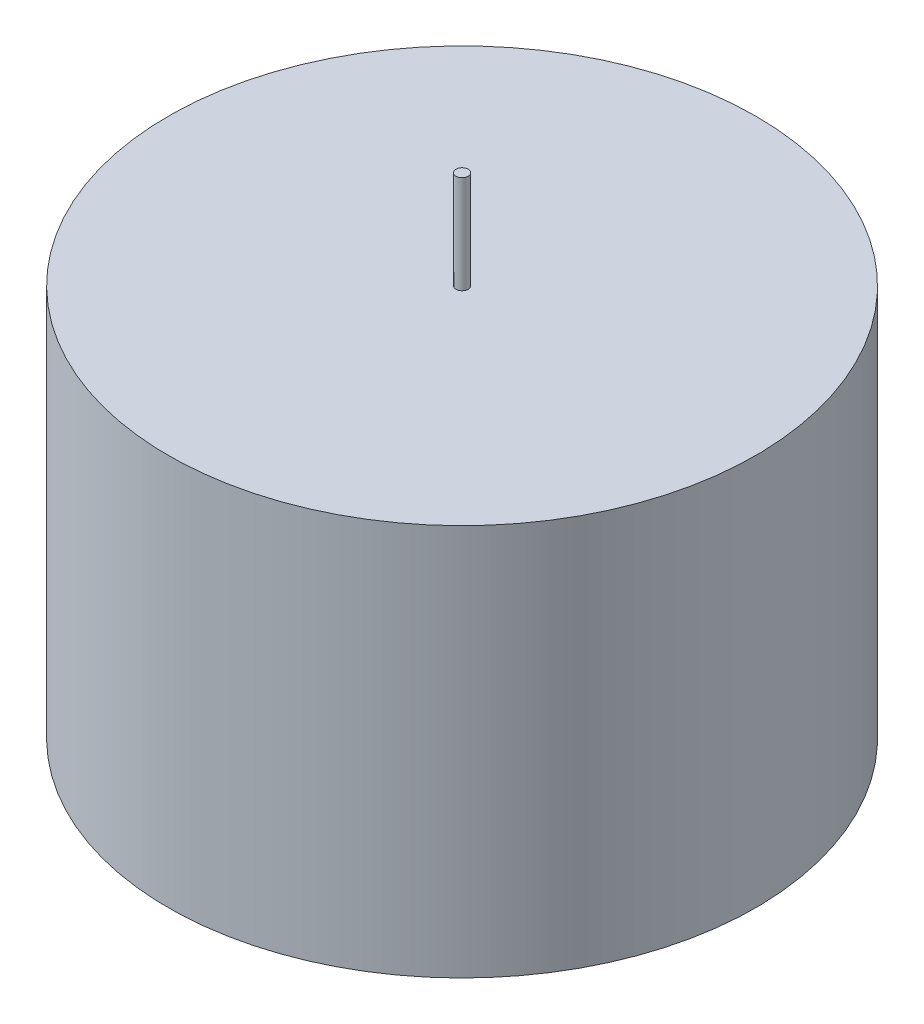
ISO-10303-21;
HEADER;
FILE_DESCRIPTION(('STEP AP214'),'2;1');
FILE_NAME('part.step','',(''),(''),'','','');
FILE_SCHEMA(('AUTOMOTIVE_DESIGN { 1 0 10303 214 1 1 1 1 }'));
ENDSEC;
DATA;
#1=APPLICATION_CONTEXT('core data for automotive mechanical design processes');
#2=APPLICATION_PROTOCOL_DEFINITION('international standard','automotive_design',2000,#1);
#3=PRODUCT_CONTEXT('',#1,'mechanical');
#4=PRODUCT('Part','Part','',(#3));
#5=PRODUCT_RELATED_PRODUCT_CATEGORY('part','',(#4));
#6=PRODUCT_DEFINITION_FORMATION('','',#4);
#7=PRODUCT_DEFINITION_CONTEXT('part definition',#1,'design');
#8=PRODUCT_DEFINITION('design','',#6,#7);
#9=PRODUCT_DEFINITION_SHAPE('','',#8);
#10=(LENGTH_UNIT() NAMED_UNIT(*) SI_UNIT(.MILLI.,.METRE.));
#11=(NAMED_UNIT(*) PLANE_ANGLE_UNIT() SI_UNIT($,.RADIAN.));
#12=(NAMED_UNIT(*) SI_UNIT($,.STERADIAN.) SOLID_ANGLE_UNIT());
#13=UNCERTAINTY_MEASURE_WITH_UNIT(LENGTH_MEASURE(1.E-05),#10,'distance_accuracy_value','');
#14=(GEOMETRIC_REPRESENTATION_CONTEXT(3) GLOBAL_UNCERTAINTY_ASSIGNED_CONTEXT((#13)) GLOBAL_UNIT_ASSIGNED_CONTEXT((#10,
#11,#12)) REPRESENTATION_CONTEXT('',''));
#15=CARTESIAN_POINT('',(0.,0.,0.));
#16=DIRECTION('',(0.,0.,1.));
#17=DIRECTION('',(1.,0.,0.));
#18=AXIS2_PLACEMENT_3D('',#15,#16,#17);
#19=CARTESIAN_POINT('',(0.,609.6,0.));
#20=DIRECTION('',(0.,-1.,0.));
#21=DIRECTION('',(0.,0.,-1.));
#22=AXIS2_PLACEMENT_3D('',#19,#20,#21);
#23=CYLINDRICAL_SURFACE('',#22,457.2);
#24=CARTESIAN_POINT('',(0.,609.6,0.));
#25=DIRECTION('',(0.,1.,0.));
#26=DIRECTION('',(0.,0.,1.));
#27=AXIS2_PLACEMENT_3D('',#24,#25,#26);
#28=CIRCLE('',#27,457.2);
#29=CARTESIAN_POINT('',(0.,609.6,-457.2));
#30=VERTEX_POINT('',#29);
#31=EDGE_CURVE('E38',#30,#30,#28,.T.);
#32=CARTESIAN_POINT('',(0.,0.,0.));
#33=DIRECTION('',(0.,1.,0.));
#34=DIRECTION('',(0.,0.,1.));
#35=AXIS2_PLACEMENT_3D('',#32,#33,#34);
#36=CIRCLE('',#35,457.2);
#37=CARTESIAN_POINT('',(0.,0.,-457.2));
#38=VERTEX_POINT('',#37);
#39=EDGE_CURVE('E43',#38,#38,#36,.T.);
#40=CARTESIAN_POINT('',(0.,609.6,-457.2));
#41=CARTESIAN_POINT('',(0.,603.25,-457.2));
#42=CARTESIAN_POINT('',(0.,596.9,-457.2));
#43=CARTESIAN_POINT('',(0.,584.2,-457.2));
#44=CARTESIAN_POINT('',(0.,577.85,-457.2));
#45=CARTESIAN_POINT('',(0.,565.15,-457.2));
#46=CARTESIAN_POINT('',(0.,558.8,-457.2));
#47=CARTESIAN_POINT('',(0.,546.1,-457.2));
#48=CARTESIAN_POINT('',(0.,539.75,-457.2));
#49=CARTESIAN_POINT('',(0.,527.05,-457.2));
#50=CARTESIAN_POINT('',(0.,520.7,-457.2));
#51=CARTESIAN_POINT('',(0.,508.,-457.2));
#52=CARTESIAN_POINT('',(0.,501.65,-457.2));
#53=CARTESIAN_POINT('',(0.,488.95,-457.2));
#54=CARTESIAN_POINT('',(0.,482.6,-457.2));
#55=CARTESIAN_POINT('',(0.,469.9,-457.2));
#56=CARTESIAN_POINT('',(0.,463.55,-457.2));
#57=CARTESIAN_POINT('',(0.,450.85,-457.2));
#58=CARTESIAN_POINT('',(0.,444.5,-457.2));
#59=CARTESIAN_POINT('',(0.,431.8,-457.2));
#60=CARTESIAN_POINT('',(0.,425.45,-457.2));
#61=CARTESIAN_POINT('',(0.,412.75,-457.2));
#62=CARTESIAN_POINT('',(0.,406.4,-457.2));
#63=CARTESIAN_POINT('',(0.,393.7,-457.2));
#64=CARTESIAN_POINT('',(0.,387.35,-457.2));
#65=CARTESIAN_POINT('',(0.,374.65,-457.2));
#66=CARTESIAN_POINT('',(0.,368.3,-457.2));
#67=CARTESIAN_POINT('',(0.,355.6,-457.2));
#68=CARTESIAN_POINT('',(0.,349.25,-457.2));
#69=CARTESIAN_POINT('',(0.,336.55,-457.2));
#70=CARTESIAN_POINT('',(0.,330.2,-457.2));
#71=CARTESIAN_POINT('',(0.,317.5,-457.2));
#72=CARTESIAN_POINT('',(0.,311.15,-457.2));
#73=CARTESIAN_POINT('',(0.,298.45,-457.2));
#74=CARTESIAN_POINT('',(0.,292.1,-457.2));
#75=CARTESIAN_POINT('',(0.,279.4,-457.2));
#76=CARTESIAN_POINT('',(0.,273.05,-457.2));
#77=CARTESIAN_POINT('',(0.,260.35,-457.2));
#78=CARTESIAN_POINT('',(0.,254.,-457.2));
#79=CARTESIAN_POINT('',(0.,241.3,-457.2));
#80=CARTESIAN_POINT('',(0.,234.95,-457.2));
#81=CARTESIAN_POINT('',(0.,222.25,-457.2));
#82=CARTESIAN_POINT('',(0.,215.9,-457.2));
#83=CARTESIAN_POINT('',(0.,203.2,-457.2));
#84=CARTESIAN_POINT('',(0.,196.85,-457.2));
#85=CARTESIAN_POINT('',(0.,184.15,-457.2));
#86=CARTESIAN_POINT('',(0.,177.8,-457.2));
#87=CARTESIAN_POINT('',(0.,165.1,-457.2));
#88=CARTESIAN_POINT('',(0.,158.75,-457.2));
#89=CARTESIAN_POINT('',(0.,146.05,-457.2));
#90=CARTESIAN_POINT('',(0.,139.7,-457.2));
#91=CARTESIAN_POINT('',(0.,127.,-457.2));
#92=CARTESIAN_POINT('',(0.,120.65,-457.2));
#93=CARTESIAN_POINT('',(0.,107.95,-457.2));
#94=CARTESIAN_POINT('',(0.,101.6,-457.2));
#95=CARTESIAN_POINT('',(0.,88.9,-457.2));
#96=CARTESIAN_POINT('',(0.,82.5500000000001,-457.2));
#97=CARTESIAN_POINT('',(0.,69.85,-457.2));
#98=CARTESIAN_POINT('',(0.,63.5,-457.2));
#99=CARTESIAN_POINT('',(0.,50.8,-457.2));
#100=CARTESIAN_POINT('',(0.,44.45,-457.2));
#101=CARTESIAN_POINT('',(0.,31.75,-457.2));
#102=CARTESIAN_POINT('',(0.,25.4,-457.2));
#103=CARTESIAN_POINT('',(0.,12.7,-457.2));
#104=CARTESIAN_POINT('',(0.,6.35000000000001,-457.2));
#105=CARTESIAN_POINT('',(0.,0.,-457.2));
#106=B_SPLINE_CURVE_WITH_KNOTS('',3,(#40,#41,#42,#43,#44,#45,#46,#47,#48,#49,#50,#51,#52,#53,
#54,#55,#56,#57,#58,#59,#60,#61,#62,#63,#64,#65,#66,#67,#68,#69,#70,#71,#72,#73,#74,#75,#76,#77,
#78,#79,#80,#81,#82,#83,#84,#85,#86,#87,#88,#89,#90,#91,#92,#93,#94,#95,#96,#97,#98,#99,#100,
#101,#102,#103,#104,#105),.UNSPECIFIED.,.F.,.F.,(4,2,2,2,2,2,2,2,2,2,2,2,2,2,2,2,2,2,2,2,2,2,2,
2,2,2,2,2,2,2,2,2,4),(0.,19.05,38.1,57.15,76.2,95.2500000000001,114.3,133.35,152.4,171.45,190.5,
209.55,228.6,247.65,266.7,285.75,304.8,323.85,342.9,361.95,381.,400.05,419.1,438.15,457.2,
476.25,495.3,514.35,533.4,552.45,571.5,590.55,609.6),.UNSPECIFIED.);
#107=EDGE_CURVE('BSEAM31',#30,#38,#106,.T.);
#108=ORIENTED_EDGE('',*,*,#31,.F.);
#109=ORIENTED_EDGE('',*,*,#39,.T.);
#110=ORIENTED_EDGE('',*,*,#107,.T.);
#111=ORIENTED_EDGE('',*,*,#107,.F.);
#112=EDGE_LOOP('',(#108,#110,#109,#111));
#113=FACE_BOUND('',#112,.T.);
#114=ADVANCED_FACE('F31',(#113),#23,.T.);
#115=CARTESIAN_POINT('',(0.,609.6,0.));
#116=DIRECTION('',(0.,1.,0.));
#117=DIRECTION('',(0.,0.,1.));
#118=AXIS2_PLACEMENT_3D('',#115,#116,#117);
#119=PLANE('',#118);
#120=CARTESIAN_POINT('',(0.,609.6,0.));
#121=DIRECTION('',(0.,1.,0.));
#122=DIRECTION('',(0.,0.,1.));
#123=AXIS2_PLACEMENT_3D('',#120,#121,#122);
#124=CIRCLE('',#123,9.525);
#125=CARTESIAN_POINT('',(0.,609.6,9.525));
#126=VERTEX_POINT('',#125);
#127=EDGE_CURVE('E10',#126,#126,#124,.T.);
#128=ORIENTED_EDGE('',*,*,#127,.F.);
#129=EDGE_LOOP('',(#128));
#130=FACE_BOUND('',#129,.T.);
#131=ORIENTED_EDGE('',*,*,#31,.T.);
#132=EDGE_LOOP('',(#131));
#133=FACE_BOUND('',#132,.T.);
#134=ADVANCED_FACE('F76',(#130,#133),#119,.T.);
#135=CARTESIAN_POINT('',(0.,0.,0.));
#136=DIRECTION('',(0.,1.,0.));
#137=DIRECTION('',(0.,0.,1.));
#138=AXIS2_PLACEMENT_3D('',#135,#136,#137);
#139=PLANE('',#138);
#140=CARTESIAN_POINT('',(0.,0.,0.));
#141=DIRECTION('',(0.,1.,0.));
#142=DIRECTION('',(0.,0.,1.));
#143=AXIS2_PLACEMENT_3D('',#140,#141,#142);
#144=CIRCLE('',#143,9.525);
#145=CARTESIAN_POINT('',(0.,0.,9.525));
#146=VERTEX_POINT('',#145);
#147=EDGE_CURVE('E34',#146,#146,#144,.T.);
#148=ORIENTED_EDGE('',*,*,#147,.T.);
#149=EDGE_LOOP('',(#148));
#150=FACE_BOUND('',#149,.T.);
#151=ORIENTED_EDGE('',*,*,#39,.F.);
#152=EDGE_LOOP('',(#151));
#153=FACE_BOUND('',#152,.T.);
#154=ADVANCED_FACE('F81',(#150,#153),#139,.F.);
#155=CARTESIAN_POINT('',(0.,-152.4,0.));
#156=DIRECTION('',(0.,1.,0.));
#157=DIRECTION('',(0.,0.,1.));
#158=AXIS2_PLACEMENT_3D('',#155,#156,#157);
#159=PLANE('',#158);
#160=CARTESIAN_POINT('',(0.,-152.4,0.));
#161=DIRECTION('',(0.,1.,0.));
#162=DIRECTION('',(0.,0.,1.));
#163=AXIS2_PLACEMENT_3D('',#160,#161,#162);
#164=CIRCLE('',#163,9.525);
#165=CARTESIAN_POINT('',(0.,-152.4,9.525));
#166=VERTEX_POINT('',#165);
#167=EDGE_CURVE('E46',#166,#166,#164,.T.);
#168=ORIENTED_EDGE('',*,*,#167,.F.);
#169=EDGE_LOOP('',(#168));
#170=FACE_BOUND('',#169,.T.);
#171=ADVANCED_FACE('F72',(#170),#159,.F.);
#172=CARTESIAN_POINT('',(0.,-152.4,0.));
#173=DIRECTION('',(0.,1.,0.));
#174=DIRECTION('',(0.,0.,1.));
#175=AXIS2_PLACEMENT_3D('',#172,#173,#174);
#176=CYLINDRICAL_SURFACE('',#175,9.525);
#177=ORIENTED_EDGE('',*,*,#167,.T.);
#178=EDGE_LOOP('',(#177));
#179=FACE_BOUND('',#178,.T.);
#180=ORIENTED_EDGE('',*,*,#147,.F.);
#181=EDGE_LOOP('',(#180));
#182=FACE_BOUND('',#181,.T.);
#183=ADVANCED_FACE('F65',(#179,#182),#176,.T.);
#184=ORIENTED_EDGE('',*,*,#127,.T.);
#185=EDGE_LOOP('',(#184));
#186=FACE_BOUND('',#185,.T.);
#187=CARTESIAN_POINT('',(0.,762.,0.));
#188=DIRECTION('',(0.,1.,0.));
#189=DIRECTION('',(0.,0.,1.));
#190=AXIS2_PLACEMENT_3D('',#187,#188,#189);
#191=CIRCLE('',#190,9.525);
#192=CARTESIAN_POINT('',(0.,762.,9.525));
#193=VERTEX_POINT('',#192);
#194=EDGE_CURVE('E55',#193,#193,#191,.T.);
#195=ORIENTED_EDGE('',*,*,#194,.F.);
#196=EDGE_LOOP('',(#195));
#197=FACE_BOUND('',#196,.T.);
#198=ADVANCED_FACE('F63',(#186,#197),#176,.T.);
#199=CARTESIAN_POINT('',(0.,762.,0.));
#200=DIRECTION('',(0.,1.,0.));
#201=DIRECTION('',(0.,0.,1.));
#202=AXIS2_PLACEMENT_3D('',#199,#200,#201);
#203=PLANE('',#202);
#204=ORIENTED_EDGE('',*,*,#194,.T.);
#205=EDGE_LOOP('',(#204));
#206=FACE_BOUND('',#205,.T.);
#207=ADVANCED_FACE('F61',(#206),#203,.T.);
#208=CLOSED_SHELL('',(#114,#134,#154,#171,#183,#198,#207));
#209=MANIFOLD_SOLID_BREP('B2',#208);
#210=ADVANCED_BREP_SHAPE_REPRESENTATION('',(#18,#209),#14);
#211=SHAPE_DEFINITION_REPRESENTATION(#9,#210);
ENDSEC;
END-ISO-10303-21;
